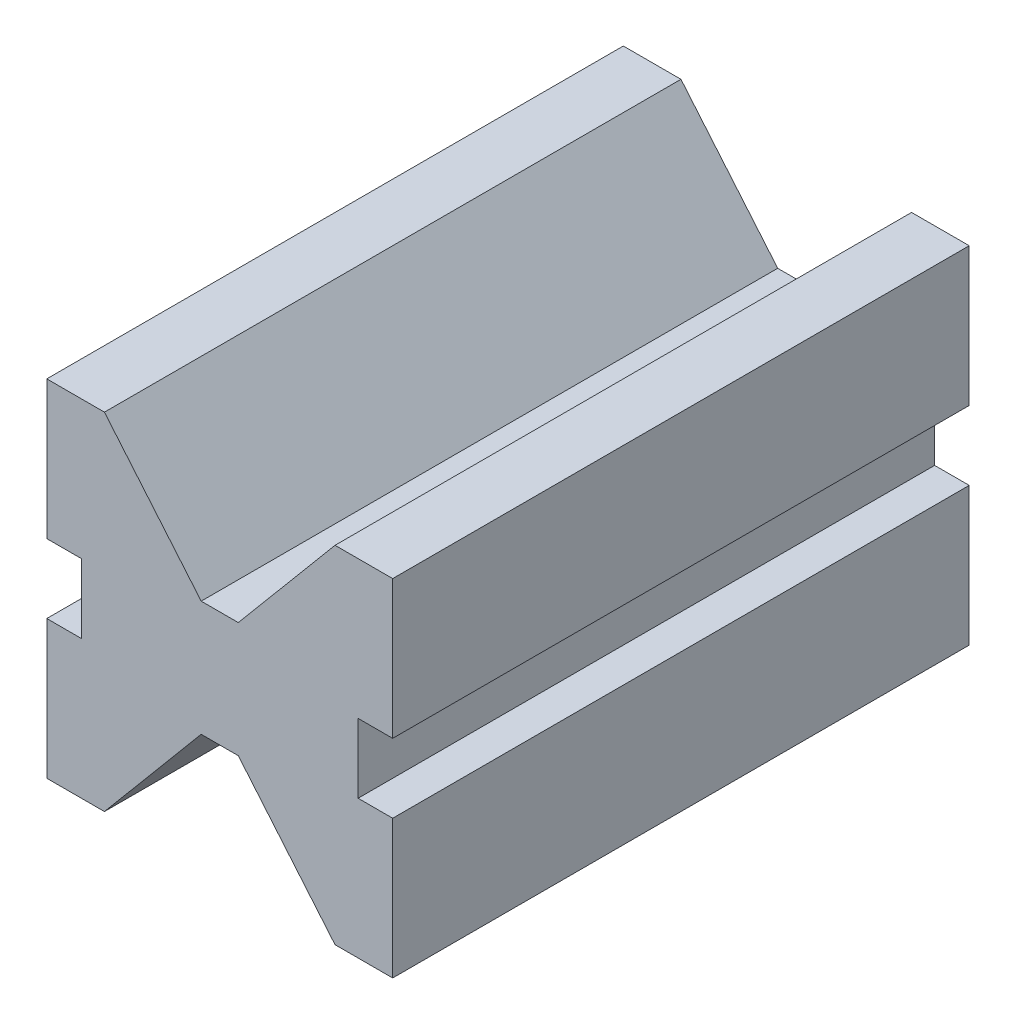
ISO-10303-21;
HEADER;
FILE_DESCRIPTION(('STEP AP214'),'2;1');
FILE_NAME('part.step','',(''),(''),'','','');
FILE_SCHEMA(('AUTOMOTIVE_DESIGN { 1 0 10303 214 1 1 1 1 }'));
ENDSEC;
DATA;
#1=APPLICATION_CONTEXT('core data for automotive mechanical design processes');
#2=APPLICATION_PROTOCOL_DEFINITION('international standard','automotive_design',2000,#1);
#3=PRODUCT_CONTEXT('',#1,'mechanical');
#4=PRODUCT('Part','Part','',(#3));
#5=PRODUCT_RELATED_PRODUCT_CATEGORY('part','',(#4));
#6=PRODUCT_DEFINITION_FORMATION('','',#4);
#7=PRODUCT_DEFINITION_CONTEXT('part definition',#1,'design');
#8=PRODUCT_DEFINITION('design','',#6,#7);
#9=PRODUCT_DEFINITION_SHAPE('','',#8);
#10=(LENGTH_UNIT() NAMED_UNIT(*) SI_UNIT(.MILLI.,.METRE.));
#11=(NAMED_UNIT(*) PLANE_ANGLE_UNIT() SI_UNIT($,.RADIAN.));
#12=(NAMED_UNIT(*) SI_UNIT($,.STERADIAN.) SOLID_ANGLE_UNIT());
#13=UNCERTAINTY_MEASURE_WITH_UNIT(LENGTH_MEASURE(1.E-05),#10,'distance_accuracy_value','');
#14=(GEOMETRIC_REPRESENTATION_CONTEXT(3) GLOBAL_UNCERTAINTY_ASSIGNED_CONTEXT((#13)) GLOBAL_UNIT_ASSIGNED_CONTEXT((#10,
#11,#12)) REPRESENTATION_CONTEXT('',''));
#15=CARTESIAN_POINT('',(0.,0.,0.));
#16=DIRECTION('',(0.,0.,1.));
#17=DIRECTION('',(1.,0.,0.));
#18=AXIS2_PLACEMENT_3D('',#15,#16,#17);
#19=CARTESIAN_POINT('',(0.,0.,-100.));
#20=DIRECTION('',(-1.,0.,0.));
#21=DIRECTION('',(0.,0.,1.));
#22=AXIS2_PLACEMENT_3D('',#19,#20,#21);
#23=PLANE('',#22);
#24=DIRECTION('',(0.,-1.,0.));
#25=VECTOR('',#24,1.);
#26=CARTESIAN_POINT('',(0.,0.,0.));
#27=LINE('',#26,#25);
#28=CARTESIAN_POINT('',(0.,24.,0.));
#29=VERTEX_POINT('',#28);
#30=CARTESIAN_POINT('',(0.,0.,0.));
#31=VERTEX_POINT('',#30);
#32=EDGE_CURVE('E204',#29,#31,#27,.T.);
#33=ORIENTED_EDGE('',*,*,#32,.F.);
#34=DIRECTION('',(0.,0.,1.));
#35=VECTOR('',#34,1.);
#36=CARTESIAN_POINT('',(0.,24.,-100.));
#37=LINE('',#36,#35);
#38=CARTESIAN_POINT('',(0.,24.,-100.));
#39=VERTEX_POINT('',#38);
#40=EDGE_CURVE('E11',#39,#29,#37,.T.);
#41=ORIENTED_EDGE('',*,*,#40,.F.);
#42=DIRECTION('',(0.,-1.,0.));
#43=VECTOR('',#42,1.);
#44=CARTESIAN_POINT('',(0.,0.,-100.));
#45=LINE('',#44,#43);
#46=CARTESIAN_POINT('',(0.,0.,-100.));
#47=VERTEX_POINT('',#46);
#48=EDGE_CURVE('E260',#39,#47,#45,.T.);
#49=ORIENTED_EDGE('',*,*,#48,.T.);
#50=DIRECTION('',(0.,0.,1.));
#51=VECTOR('',#50,1.);
#52=CARTESIAN_POINT('',(0.,0.,-100.));
#53=LINE('',#52,#51);
#54=EDGE_CURVE('E38',#47,#31,#53,.T.);
#55=ORIENTED_EDGE('',*,*,#54,.T.);
#56=EDGE_LOOP('',(#33,#41,#49,#55));
#57=FACE_BOUND('',#56,.T.);
#58=ADVANCED_FACE('F35',(#57),#23,.T.);
#59=CARTESIAN_POINT('',(0.,24.,-100.));
#60=DIRECTION('',(0.,1.,0.));
#61=DIRECTION('',(0.,0.,1.));
#62=AXIS2_PLACEMENT_3D('',#59,#60,#61);
#63=PLANE('',#62);
#64=DIRECTION('',(-1.,0.,0.));
#65=VECTOR('',#64,1.);
#66=CARTESIAN_POINT('',(0.,24.,0.));
#67=LINE('',#66,#65);
#68=CARTESIAN_POINT('',(6.,24.,0.));
#69=VERTEX_POINT('',#68);
#70=EDGE_CURVE('E258',#69,#29,#67,.T.);
#71=ORIENTED_EDGE('',*,*,#70,.F.);
#72=DIRECTION('',(0.,0.,1.));
#73=VECTOR('',#72,1.);
#74=CARTESIAN_POINT('',(6.,24.,-100.));
#75=LINE('',#74,#73);
#76=CARTESIAN_POINT('',(6.,24.,-100.));
#77=VERTEX_POINT('',#76);
#78=EDGE_CURVE('E44',#77,#69,#75,.T.);
#79=ORIENTED_EDGE('',*,*,#78,.F.);
#80=DIRECTION('',(-1.,0.,0.));
#81=VECTOR('',#80,1.);
#82=CARTESIAN_POINT('',(0.,24.,-100.));
#83=LINE('',#82,#81);
#84=EDGE_CURVE('E194',#77,#39,#83,.T.);
#85=ORIENTED_EDGE('',*,*,#84,.T.);
#86=ORIENTED_EDGE('',*,*,#40,.T.);
#87=EDGE_LOOP('',(#71,#79,#85,#86));
#88=FACE_BOUND('',#87,.T.);
#89=ADVANCED_FACE('F296',(#88),#63,.T.);
#90=CARTESIAN_POINT('',(6.,24.,-100.));
#91=DIRECTION('',(-1.,0.,0.));
#92=DIRECTION('',(0.,0.,1.));
#93=AXIS2_PLACEMENT_3D('',#90,#91,#92);
#94=PLANE('',#93);
#95=DIRECTION('',(0.,-1.,0.));
#96=VECTOR('',#95,1.);
#97=CARTESIAN_POINT('',(6.,24.,0.));
#98=LINE('',#97,#96);
#99=CARTESIAN_POINT('',(6.,36.,0.));
#100=VERTEX_POINT('',#99);
#101=EDGE_CURVE('E181',#100,#69,#98,.T.);
#102=ORIENTED_EDGE('',*,*,#101,.F.);
#103=DIRECTION('',(0.,0.,1.));
#104=VECTOR('',#103,1.);
#105=CARTESIAN_POINT('',(6.,36.,-100.));
#106=LINE('',#105,#104);
#107=CARTESIAN_POINT('',(6.,36.,-100.));
#108=VERTEX_POINT('',#107);
#109=EDGE_CURVE('E176',#108,#100,#106,.T.);
#110=ORIENTED_EDGE('',*,*,#109,.F.);
#111=DIRECTION('',(0.,-1.,0.));
#112=VECTOR('',#111,1.);
#113=CARTESIAN_POINT('',(6.,24.,-100.));
#114=LINE('',#113,#112);
#115=EDGE_CURVE('E179',#108,#77,#114,.T.);
#116=ORIENTED_EDGE('',*,*,#115,.T.);
#117=ORIENTED_EDGE('',*,*,#78,.T.);
#118=EDGE_LOOP('',(#102,#110,#116,#117));
#119=FACE_BOUND('',#118,.T.);
#120=ADVANCED_FACE('F178',(#119),#94,.T.);
#121=CARTESIAN_POINT('',(6.,36.,-100.));
#122=DIRECTION('',(0.,-1.,0.));
#123=DIRECTION('',(0.,0.,-1.));
#124=AXIS2_PLACEMENT_3D('',#121,#122,#123);
#125=PLANE('',#124);
#126=DIRECTION('',(1.,0.,0.));
#127=VECTOR('',#126,1.);
#128=CARTESIAN_POINT('',(6.,36.,0.));
#129=LINE('',#128,#127);
#130=CARTESIAN_POINT('',(0.,36.,0.));
#131=VERTEX_POINT('',#130);
#132=EDGE_CURVE('E255',#131,#100,#129,.T.);
#133=ORIENTED_EDGE('',*,*,#132,.F.);
#134=DIRECTION('',(0.,0.,1.));
#135=VECTOR('',#134,1.);
#136=CARTESIAN_POINT('',(0.,36.,-100.));
#137=LINE('',#136,#135);
#138=CARTESIAN_POINT('',(0.,36.,-100.));
#139=VERTEX_POINT('',#138);
#140=EDGE_CURVE('E186',#139,#131,#137,.T.);
#141=ORIENTED_EDGE('',*,*,#140,.F.);
#142=DIRECTION('',(1.,0.,0.));
#143=VECTOR('',#142,1.);
#144=CARTESIAN_POINT('',(6.,36.,-100.));
#145=LINE('',#144,#143);
#146=EDGE_CURVE('E192',#139,#108,#145,.T.);
#147=ORIENTED_EDGE('',*,*,#146,.T.);
#148=ORIENTED_EDGE('',*,*,#109,.T.);
#149=EDGE_LOOP('',(#133,#141,#147,#148));
#150=FACE_BOUND('',#149,.T.);
#151=ADVANCED_FACE('F196',(#150),#125,.T.);
#152=CARTESIAN_POINT('',(0.,36.,-100.));
#153=DIRECTION('',(-1.,0.,0.));
#154=DIRECTION('',(0.,0.,1.));
#155=AXIS2_PLACEMENT_3D('',#152,#153,#154);
#156=PLANE('',#155);
#157=DIRECTION('',(0.,-1.,0.));
#158=VECTOR('',#157,1.);
#159=CARTESIAN_POINT('',(0.,36.,0.));
#160=LINE('',#159,#158);
#161=CARTESIAN_POINT('',(0.,60.,0.));
#162=VERTEX_POINT('',#161);
#163=EDGE_CURVE('E252',#162,#131,#160,.T.);
#164=ORIENTED_EDGE('',*,*,#163,.F.);
#165=DIRECTION('',(0.,0.,1.));
#166=VECTOR('',#165,1.);
#167=CARTESIAN_POINT('',(0.,60.,-100.));
#168=LINE('',#167,#166);
#169=CARTESIAN_POINT('',(0.,60.,-100.));
#170=VERTEX_POINT('',#169);
#171=EDGE_CURVE('E264',#170,#162,#168,.T.);
#172=ORIENTED_EDGE('',*,*,#171,.F.);
#173=DIRECTION('',(0.,-1.,0.));
#174=VECTOR('',#173,1.);
#175=CARTESIAN_POINT('',(0.,36.,-100.));
#176=LINE('',#175,#174);
#177=EDGE_CURVE('E197',#170,#139,#176,.T.);
#178=ORIENTED_EDGE('',*,*,#177,.T.);
#179=ORIENTED_EDGE('',*,*,#140,.T.);
#180=EDGE_LOOP('',(#164,#172,#178,#179));
#181=FACE_BOUND('',#180,.T.);
#182=ADVANCED_FACE('F309',(#181),#156,.T.);
#183=CARTESIAN_POINT('',(0.,60.,-100.));
#184=DIRECTION('',(0.,1.,0.));
#185=DIRECTION('',(0.,0.,1.));
#186=AXIS2_PLACEMENT_3D('',#183,#184,#185);
#187=PLANE('',#186);
#188=DIRECTION('',(-1.,0.,0.));
#189=VECTOR('',#188,1.);
#190=CARTESIAN_POINT('',(0.,60.,0.));
#191=LINE('',#190,#189);
#192=CARTESIAN_POINT('',(10.,60.,0.));
#193=VERTEX_POINT('',#192);
#194=EDGE_CURVE('E249',#193,#162,#191,.T.);
#195=ORIENTED_EDGE('',*,*,#194,.F.);
#196=DIRECTION('',(0.,0.,1.));
#197=VECTOR('',#196,1.);
#198=CARTESIAN_POINT('',(10.,60.,-100.));
#199=LINE('',#198,#197);
#200=CARTESIAN_POINT('',(10.,60.,-100.));
#201=VERTEX_POINT('',#200);
#202=EDGE_CURVE('E266',#201,#193,#199,.T.);
#203=ORIENTED_EDGE('',*,*,#202,.F.);
#204=DIRECTION('',(-1.,0.,0.));
#205=VECTOR('',#204,1.);
#206=CARTESIAN_POINT('',(0.,60.,-100.));
#207=LINE('',#206,#205);
#208=EDGE_CURVE('E199',#201,#170,#207,.T.);
#209=ORIENTED_EDGE('',*,*,#208,.T.);
#210=ORIENTED_EDGE('',*,*,#171,.T.);
#211=EDGE_LOOP('',(#195,#203,#209,#210));
#212=FACE_BOUND('',#211,.T.);
#213=ADVANCED_FACE('F312',(#212),#187,.T.);
#214=CARTESIAN_POINT('',(10.,60.,-100.));
#215=DIRECTION('',(0.766044443118979,0.642787609686539,0.));
#216=DIRECTION('',(-0.642787609686539,0.766044443118979,0.));
#217=AXIS2_PLACEMENT_3D('',#214,#215,#216);
#218=PLANE('',#217);
#219=DIRECTION('',(-0.642787609686538,0.766044443118979,0.));
#220=VECTOR('',#219,1.);
#221=CARTESIAN_POINT('',(10.,60.,0.));
#222=LINE('',#221,#220);
#223=CARTESIAN_POINT('',(26.7819926235456,40.,0.));
#224=VERTEX_POINT('',#223);
#225=EDGE_CURVE('E246',#224,#193,#222,.T.);
#226=ORIENTED_EDGE('',*,*,#225,.F.);
#227=DIRECTION('',(0.,0.,1.));
#228=VECTOR('',#227,1.);
#229=CARTESIAN_POINT('',(26.7819926235456,40.,-100.));
#230=LINE('',#229,#228);
#231=CARTESIAN_POINT('',(26.7819926235456,40.,-100.));
#232=VERTEX_POINT('',#231);
#233=EDGE_CURVE('E268',#232,#224,#230,.T.);
#234=ORIENTED_EDGE('',*,*,#233,.F.);
#235=DIRECTION('',(-0.642787609686538,0.766044443118979,0.));
#236=VECTOR('',#235,1.);
#237=CARTESIAN_POINT('',(10.,60.,-100.));
#238=LINE('',#237,#236);
#239=EDGE_CURVE('E551',#232,#201,#238,.T.);
#240=ORIENTED_EDGE('',*,*,#239,.T.);
#241=ORIENTED_EDGE('',*,*,#202,.T.);
#242=EDGE_LOOP('',(#226,#234,#240,#241));
#243=FACE_BOUND('',#242,.T.);
#244=ADVANCED_FACE('F316',(#243),#218,.T.);
#245=CARTESIAN_POINT('',(26.7819926235456,40.,-100.));
#246=DIRECTION('',(0.,1.,0.));
#247=DIRECTION('',(0.,0.,1.));
#248=AXIS2_PLACEMENT_3D('',#245,#246,#247);
#249=PLANE('',#248);
#250=DIRECTION('',(-1.,0.,0.));
#251=VECTOR('',#250,1.);
#252=CARTESIAN_POINT('',(26.7819926235456,40.,0.));
#253=LINE('',#252,#251);
#254=CARTESIAN_POINT('',(33.2180073764544,40.,0.));
#255=VERTEX_POINT('',#254);
#256=EDGE_CURVE('E243',#255,#224,#253,.T.);
#257=ORIENTED_EDGE('',*,*,#256,.F.);
#258=DIRECTION('',(0.,0.,1.));
#259=VECTOR('',#258,1.);
#260=CARTESIAN_POINT('',(33.2180073764544,40.,-100.));
#261=LINE('',#260,#259);
#262=CARTESIAN_POINT('',(33.2180073764544,40.,-100.));
#263=VERTEX_POINT('',#262);
#264=EDGE_CURVE('E270',#263,#255,#261,.T.);
#265=ORIENTED_EDGE('',*,*,#264,.F.);
#266=DIRECTION('',(-1.,0.,0.));
#267=VECTOR('',#266,1.);
#268=CARTESIAN_POINT('',(26.7819926235456,40.,-100.));
#269=LINE('',#268,#267);
#270=EDGE_CURVE('E544',#263,#232,#269,.T.);
#271=ORIENTED_EDGE('',*,*,#270,.T.);
#272=ORIENTED_EDGE('',*,*,#233,.T.);
#273=EDGE_LOOP('',(#257,#265,#271,#272));
#274=FACE_BOUND('',#273,.T.);
#275=ADVANCED_FACE('F320',(#274),#249,.T.);
#276=CARTESIAN_POINT('',(50.,60.,-100.));
#277=DIRECTION('',(-0.766044443118979,0.642787609686538,0.));
#278=DIRECTION('',(-0.642787609686538,-0.766044443118979,0.));
#279=AXIS2_PLACEMENT_3D('',#276,#277,#278);
#280=PLANE('',#279);
#281=DIRECTION('',(-0.642787609686538,-0.766044443118979,0.));
#282=VECTOR('',#281,1.);
#283=CARTESIAN_POINT('',(50.,60.,0.));
#284=LINE('',#283,#282);
#285=CARTESIAN_POINT('',(50.,60.,0.));
#286=VERTEX_POINT('',#285);
#287=EDGE_CURVE('E240',#286,#255,#284,.T.);
#288=ORIENTED_EDGE('',*,*,#287,.F.);
#289=DIRECTION('',(0.,0.,1.));
#290=VECTOR('',#289,1.);
#291=CARTESIAN_POINT('',(50.,60.,-100.));
#292=LINE('',#291,#290);
#293=CARTESIAN_POINT('',(50.,60.,-100.));
#294=VERTEX_POINT('',#293);
#295=EDGE_CURVE('E272',#294,#286,#292,.T.);
#296=ORIENTED_EDGE('',*,*,#295,.F.);
#297=DIRECTION('',(-0.642787609686538,-0.766044443118979,0.));
#298=VECTOR('',#297,1.);
#299=CARTESIAN_POINT('',(50.,60.,-100.));
#300=LINE('',#299,#298);
#301=EDGE_CURVE('E540',#294,#263,#300,.T.);
#302=ORIENTED_EDGE('',*,*,#301,.T.);
#303=ORIENTED_EDGE('',*,*,#264,.T.);
#304=EDGE_LOOP('',(#288,#296,#302,#303));
#305=FACE_BOUND('',#304,.T.);
#306=ADVANCED_FACE('F324',(#305),#280,.T.);
#307=CARTESIAN_POINT('',(60.,60.,-100.));
#308=DIRECTION('',(0.,1.,0.));
#309=DIRECTION('',(0.,0.,1.));
#310=AXIS2_PLACEMENT_3D('',#307,#308,#309);
#311=PLANE('',#310);
#312=DIRECTION('',(-1.,0.,0.));
#313=VECTOR('',#312,1.);
#314=CARTESIAN_POINT('',(60.,60.,0.));
#315=LINE('',#314,#313);
#316=CARTESIAN_POINT('',(60.,60.,0.));
#317=VERTEX_POINT('',#316);
#318=EDGE_CURVE('E237',#317,#286,#315,.T.);
#319=ORIENTED_EDGE('',*,*,#318,.F.);
#320=DIRECTION('',(0.,0.,1.));
#321=VECTOR('',#320,1.);
#322=CARTESIAN_POINT('',(60.,60.,-100.));
#323=LINE('',#322,#321);
#324=CARTESIAN_POINT('',(60.,60.,-100.));
#325=VERTEX_POINT('',#324);
#326=EDGE_CURVE('E274',#325,#317,#323,.T.);
#327=ORIENTED_EDGE('',*,*,#326,.F.);
#328=DIRECTION('',(-1.,0.,0.));
#329=VECTOR('',#328,1.);
#330=CARTESIAN_POINT('',(60.,60.,-100.));
#331=LINE('',#330,#329);
#332=EDGE_CURVE('E556',#325,#294,#331,.T.);
#333=ORIENTED_EDGE('',*,*,#332,.T.);
#334=ORIENTED_EDGE('',*,*,#295,.T.);
#335=EDGE_LOOP('',(#319,#327,#333,#334));
#336=FACE_BOUND('',#335,.T.);
#337=ADVANCED_FACE('F328',(#336),#311,.T.);
#338=CARTESIAN_POINT('',(60.,36.,-100.));
#339=DIRECTION('',(1.,0.,0.));
#340=DIRECTION('',(0.,1.,0.));
#341=AXIS2_PLACEMENT_3D('',#338,#339,#340);
#342=PLANE('',#341);
#343=DIRECTION('',(0.,1.,0.));
#344=VECTOR('',#343,1.);
#345=CARTESIAN_POINT('',(60.,36.,0.));
#346=LINE('',#345,#344);
#347=CARTESIAN_POINT('',(60.,36.,0.));
#348=VERTEX_POINT('',#347);
#349=EDGE_CURVE('E234',#348,#317,#346,.T.);
#350=ORIENTED_EDGE('',*,*,#349,.F.);
#351=DIRECTION('',(0.,0.,1.));
#352=VECTOR('',#351,1.);
#353=CARTESIAN_POINT('',(60.,36.,-100.));
#354=LINE('',#353,#352);
#355=CARTESIAN_POINT('',(60.,36.,-100.));
#356=VERTEX_POINT('',#355);
#357=EDGE_CURVE('E276',#356,#348,#354,.T.);
#358=ORIENTED_EDGE('',*,*,#357,.F.);
#359=DIRECTION('',(0.,1.,0.));
#360=VECTOR('',#359,1.);
#361=CARTESIAN_POINT('',(60.,36.,-100.));
#362=LINE('',#361,#360);
#363=EDGE_CURVE('E533',#356,#325,#362,.T.);
#364=ORIENTED_EDGE('',*,*,#363,.T.);
#365=ORIENTED_EDGE('',*,*,#326,.T.);
#366=EDGE_LOOP('',(#350,#358,#364,#365));
#367=FACE_BOUND('',#366,.T.);
#368=ADVANCED_FACE('F332',(#367),#342,.T.);
#369=CARTESIAN_POINT('',(54.,36.,-100.));
#370=DIRECTION('',(0.,-1.,0.));
#371=DIRECTION('',(0.,0.,-1.));
#372=AXIS2_PLACEMENT_3D('',#369,#370,#371);
#373=PLANE('',#372);
#374=DIRECTION('',(1.,0.,0.));
#375=VECTOR('',#374,1.);
#376=CARTESIAN_POINT('',(54.,36.,0.));
#377=LINE('',#376,#375);
#378=CARTESIAN_POINT('',(54.,36.,0.));
#379=VERTEX_POINT('',#378);
#380=EDGE_CURVE('E231',#379,#348,#377,.T.);
#381=ORIENTED_EDGE('',*,*,#380,.F.);
#382=DIRECTION('',(0.,0.,1.));
#383=VECTOR('',#382,1.);
#384=CARTESIAN_POINT('',(54.,36.,-100.));
#385=LINE('',#384,#383);
#386=CARTESIAN_POINT('',(54.,36.,-100.));
#387=VERTEX_POINT('',#386);
#388=EDGE_CURVE('E278',#387,#379,#385,.T.);
#389=ORIENTED_EDGE('',*,*,#388,.F.);
#390=DIRECTION('',(1.,0.,0.));
#391=VECTOR('',#390,1.);
#392=CARTESIAN_POINT('',(54.,36.,-100.));
#393=LINE('',#392,#391);
#394=EDGE_CURVE('E529',#387,#356,#393,.T.);
#395=ORIENTED_EDGE('',*,*,#394,.T.);
#396=ORIENTED_EDGE('',*,*,#357,.T.);
#397=EDGE_LOOP('',(#381,#389,#395,#396));
#398=FACE_BOUND('',#397,.T.);
#399=ADVANCED_FACE('F336',(#398),#373,.T.);
#400=CARTESIAN_POINT('',(54.,24.,-100.));
#401=DIRECTION('',(1.,0.,0.));
#402=DIRECTION('',(0.,1.,0.));
#403=AXIS2_PLACEMENT_3D('',#400,#401,#402);
#404=PLANE('',#403);
#405=DIRECTION('',(0.,1.,0.));
#406=VECTOR('',#405,1.);
#407=CARTESIAN_POINT('',(54.,24.,0.));
#408=LINE('',#407,#406);
#409=CARTESIAN_POINT('',(54.,24.,0.));
#410=VERTEX_POINT('',#409);
#411=EDGE_CURVE('E228',#410,#379,#408,.T.);
#412=ORIENTED_EDGE('',*,*,#411,.F.);
#413=DIRECTION('',(0.,0.,1.));
#414=VECTOR('',#413,1.);
#415=CARTESIAN_POINT('',(54.,24.,-100.));
#416=LINE('',#415,#414);
#417=CARTESIAN_POINT('',(54.,24.,-100.));
#418=VERTEX_POINT('',#417);
#419=EDGE_CURVE('E280',#418,#410,#416,.T.);
#420=ORIENTED_EDGE('',*,*,#419,.F.);
#421=DIRECTION('',(0.,1.,0.));
#422=VECTOR('',#421,1.);
#423=CARTESIAN_POINT('',(54.,24.,-100.));
#424=LINE('',#423,#422);
#425=EDGE_CURVE('E560',#418,#387,#424,.T.);
#426=ORIENTED_EDGE('',*,*,#425,.T.);
#427=ORIENTED_EDGE('',*,*,#388,.T.);
#428=EDGE_LOOP('',(#412,#420,#426,#427));
#429=FACE_BOUND('',#428,.T.);
#430=ADVANCED_FACE('F340',(#429),#404,.T.);
#431=CARTESIAN_POINT('',(60.,24.,-100.));
#432=DIRECTION('',(0.,1.,0.));
#433=DIRECTION('',(-1.,0.,0.));
#434=AXIS2_PLACEMENT_3D('',#431,#432,#433);
#435=PLANE('',#434);
#436=DIRECTION('',(-1.,0.,0.));
#437=VECTOR('',#436,1.);
#438=CARTESIAN_POINT('',(60.,24.,0.));
#439=LINE('',#438,#437);
#440=CARTESIAN_POINT('',(60.,24.,0.));
#441=VERTEX_POINT('',#440);
#442=EDGE_CURVE('E225',#441,#410,#439,.T.);
#443=ORIENTED_EDGE('',*,*,#442,.F.);
#444=DIRECTION('',(0.,0.,1.));
#445=VECTOR('',#444,1.);
#446=CARTESIAN_POINT('',(60.,24.,-100.));
#447=LINE('',#446,#445);
#448=CARTESIAN_POINT('',(60.,24.,-100.));
#449=VERTEX_POINT('',#448);
#450=EDGE_CURVE('E282',#449,#441,#447,.T.);
#451=ORIENTED_EDGE('',*,*,#450,.F.);
#452=DIRECTION('',(-1.,0.,0.));
#453=VECTOR('',#452,1.);
#454=CARTESIAN_POINT('',(60.,24.,-100.));
#455=LINE('',#454,#453);
#456=EDGE_CURVE('E522',#449,#418,#455,.T.);
#457=ORIENTED_EDGE('',*,*,#456,.T.);
#458=ORIENTED_EDGE('',*,*,#419,.T.);
#459=EDGE_LOOP('',(#443,#451,#457,#458));
#460=FACE_BOUND('',#459,.T.);
#461=ADVANCED_FACE('F344',(#460),#435,.T.);
#462=CARTESIAN_POINT('',(60.,0.,-100.));
#463=DIRECTION('',(1.,0.,0.));
#464=DIRECTION('',(0.,1.,0.));
#465=AXIS2_PLACEMENT_3D('',#462,#463,#464);
#466=PLANE('',#465);
#467=DIRECTION('',(0.,1.,0.));
#468=VECTOR('',#467,1.);
#469=CARTESIAN_POINT('',(60.,0.,0.));
#470=LINE('',#469,#468);
#471=CARTESIAN_POINT('',(60.,0.,0.));
#472=VERTEX_POINT('',#471);
#473=EDGE_CURVE('E222',#472,#441,#470,.T.);
#474=ORIENTED_EDGE('',*,*,#473,.F.);
#475=DIRECTION('',(0.,0.,1.));
#476=VECTOR('',#475,1.);
#477=CARTESIAN_POINT('',(60.,0.,-100.));
#478=LINE('',#477,#476);
#479=CARTESIAN_POINT('',(60.,0.,-100.));
#480=VERTEX_POINT('',#479);
#481=EDGE_CURVE('E284',#480,#472,#478,.T.);
#482=ORIENTED_EDGE('',*,*,#481,.F.);
#483=DIRECTION('',(0.,1.,0.));
#484=VECTOR('',#483,1.);
#485=CARTESIAN_POINT('',(60.,0.,-100.));
#486=LINE('',#485,#484);
#487=EDGE_CURVE('E518',#480,#449,#486,.T.);
#488=ORIENTED_EDGE('',*,*,#487,.T.);
#489=ORIENTED_EDGE('',*,*,#450,.T.);
#490=EDGE_LOOP('',(#474,#482,#488,#489));
#491=FACE_BOUND('',#490,.T.);
#492=ADVANCED_FACE('F348',(#491),#466,.T.);
#493=CARTESIAN_POINT('',(60.,0.,-100.));
#494=DIRECTION('',(0.,-1.,0.));
#495=DIRECTION('',(0.,0.,-1.));
#496=AXIS2_PLACEMENT_3D('',#493,#494,#495);
#497=PLANE('',#496);
#498=DIRECTION('',(1.,0.,0.));
#499=VECTOR('',#498,1.);
#500=CARTESIAN_POINT('',(60.,0.,0.));
#501=LINE('',#500,#499);
#502=CARTESIAN_POINT('',(50.,0.,0.));
#503=VERTEX_POINT('',#502);
#504=EDGE_CURVE('E219',#503,#472,#501,.T.);
#505=ORIENTED_EDGE('',*,*,#504,.F.);
#506=DIRECTION('',(0.,0.,1.));
#507=VECTOR('',#506,1.);
#508=CARTESIAN_POINT('',(50.,0.,-100.));
#509=LINE('',#508,#507);
#510=CARTESIAN_POINT('',(50.,0.,-100.));
#511=VERTEX_POINT('',#510);
#512=EDGE_CURVE('E286',#511,#503,#509,.T.);
#513=ORIENTED_EDGE('',*,*,#512,.F.);
#514=DIRECTION('',(1.,0.,0.));
#515=VECTOR('',#514,1.);
#516=CARTESIAN_POINT('',(60.,0.,-100.));
#517=LINE('',#516,#515);
#518=EDGE_CURVE('E564',#511,#480,#517,.T.);
#519=ORIENTED_EDGE('',*,*,#518,.T.);
#520=ORIENTED_EDGE('',*,*,#481,.T.);
#521=EDGE_LOOP('',(#505,#513,#519,#520));
#522=FACE_BOUND('',#521,.T.);
#523=ADVANCED_FACE('F352',(#522),#497,.T.);
#524=CARTESIAN_POINT('',(50.,0.,-100.));
#525=DIRECTION('',(-0.766044443118979,-0.642787609686539,0.));
#526=DIRECTION('',(0.642787609686539,-0.766044443118979,0.));
#527=AXIS2_PLACEMENT_3D('',#524,#525,#526);
#528=PLANE('',#527);
#529=DIRECTION('',(0.642787609686539,-0.766044443118979,0.));
#530=VECTOR('',#529,1.);
#531=CARTESIAN_POINT('',(50.,0.,0.));
#532=LINE('',#531,#530);
#533=CARTESIAN_POINT('',(33.2180073764544,20.,0.));
#534=VERTEX_POINT('',#533);
#535=EDGE_CURVE('E216',#534,#503,#532,.T.);
#536=ORIENTED_EDGE('',*,*,#535,.F.);
#537=DIRECTION('',(0.,0.,1.));
#538=VECTOR('',#537,1.);
#539=CARTESIAN_POINT('',(33.2180073764544,20.,-100.));
#540=LINE('',#539,#538);
#541=CARTESIAN_POINT('',(33.2180073764544,20.,-100.));
#542=VERTEX_POINT('',#541);
#543=EDGE_CURVE('E288',#542,#534,#540,.T.);
#544=ORIENTED_EDGE('',*,*,#543,.F.);
#545=DIRECTION('',(0.642787609686539,-0.766044443118979,0.));
#546=VECTOR('',#545,1.);
#547=CARTESIAN_POINT('',(50.,0.,-100.));
#548=LINE('',#547,#546);
#549=EDGE_CURVE('E511',#542,#511,#548,.T.);
#550=ORIENTED_EDGE('',*,*,#549,.T.);
#551=ORIENTED_EDGE('',*,*,#512,.T.);
#552=EDGE_LOOP('',(#536,#544,#550,#551));
#553=FACE_BOUND('',#552,.T.);
#554=ADVANCED_FACE('F356',(#553),#528,.T.);
#555=CARTESIAN_POINT('',(26.7819926235456,20.,-100.));
#556=DIRECTION('',(0.,-1.,0.));
#557=DIRECTION('',(0.,0.,-1.));
#558=AXIS2_PLACEMENT_3D('',#555,#556,#557);
#559=PLANE('',#558);
#560=DIRECTION('',(1.,0.,0.));
#561=VECTOR('',#560,1.);
#562=CARTESIAN_POINT('',(26.7819926235456,20.,0.));
#563=LINE('',#562,#561);
#564=CARTESIAN_POINT('',(26.7819926235456,20.,0.));
#565=VERTEX_POINT('',#564);
#566=EDGE_CURVE('E213',#565,#534,#563,.T.);
#567=ORIENTED_EDGE('',*,*,#566,.F.);
#568=DIRECTION('',(0.,0.,1.));
#569=VECTOR('',#568,1.);
#570=CARTESIAN_POINT('',(26.7819926235456,20.,-100.));
#571=LINE('',#570,#569);
#572=CARTESIAN_POINT('',(26.7819926235456,20.,-100.));
#573=VERTEX_POINT('',#572);
#574=EDGE_CURVE('E290',#573,#565,#571,.T.);
#575=ORIENTED_EDGE('',*,*,#574,.F.);
#576=DIRECTION('',(1.,0.,0.));
#577=VECTOR('',#576,1.);
#578=CARTESIAN_POINT('',(26.7819926235456,20.,-100.));
#579=LINE('',#578,#577);
#580=EDGE_CURVE('E507',#573,#542,#579,.T.);
#581=ORIENTED_EDGE('',*,*,#580,.T.);
#582=ORIENTED_EDGE('',*,*,#543,.T.);
#583=EDGE_LOOP('',(#567,#575,#581,#582));
#584=FACE_BOUND('',#583,.T.);
#585=ADVANCED_FACE('F360',(#584),#559,.T.);
#586=CARTESIAN_POINT('',(10.,0.,-100.));
#587=DIRECTION('',(0.766044443118979,-0.642787609686539,0.));
#588=DIRECTION('',(0.642787609686539,0.766044443118979,0.));
#589=AXIS2_PLACEMENT_3D('',#586,#587,#588);
#590=PLANE('',#589);
#591=DIRECTION('',(0.642787609686539,0.766044443118979,0.));
#592=VECTOR('',#591,1.);
#593=CARTESIAN_POINT('',(10.,0.,0.));
#594=LINE('',#593,#592);
#595=CARTESIAN_POINT('',(10.,0.,0.));
#596=VERTEX_POINT('',#595);
#597=EDGE_CURVE('E210',#596,#565,#594,.T.);
#598=ORIENTED_EDGE('',*,*,#597,.F.);
#599=DIRECTION('',(0.,0.,1.));
#600=VECTOR('',#599,1.);
#601=CARTESIAN_POINT('',(10.,0.,-100.));
#602=LINE('',#601,#600);
#603=CARTESIAN_POINT('',(10.,0.,-100.));
#604=VERTEX_POINT('',#603);
#605=EDGE_CURVE('E291',#604,#596,#602,.T.);
#606=ORIENTED_EDGE('',*,*,#605,.F.);
#607=DIRECTION('',(0.642787609686539,0.766044443118979,0.));
#608=VECTOR('',#607,1.);
#609=CARTESIAN_POINT('',(10.,0.,-100.));
#610=LINE('',#609,#608);
#611=EDGE_CURVE('E568',#604,#573,#610,.T.);
#612=ORIENTED_EDGE('',*,*,#611,.T.);
#613=ORIENTED_EDGE('',*,*,#574,.T.);
#614=EDGE_LOOP('',(#598,#606,#612,#613));
#615=FACE_BOUND('',#614,.T.);
#616=ADVANCED_FACE('F364',(#615),#590,.T.);
#617=CARTESIAN_POINT('',(0.,0.,-100.));
#618=DIRECTION('',(0.,-1.,0.));
#619=DIRECTION('',(0.,0.,-1.));
#620=AXIS2_PLACEMENT_3D('',#617,#618,#619);
#621=PLANE('',#620);
#622=DIRECTION('',(1.,0.,0.));
#623=VECTOR('',#622,1.);
#624=CARTESIAN_POINT('',(0.,0.,0.));
#625=LINE('',#624,#623);
#626=EDGE_CURVE('E207',#31,#596,#625,.T.);
#627=ORIENTED_EDGE('',*,*,#626,.F.);
#628=ORIENTED_EDGE('',*,*,#54,.F.);
#629=DIRECTION('',(1.,0.,0.));
#630=VECTOR('',#629,1.);
#631=CARTESIAN_POINT('',(0.,0.,-100.));
#632=LINE('',#631,#630);
#633=EDGE_CURVE('E570',#47,#604,#632,.T.);
#634=ORIENTED_EDGE('',*,*,#633,.T.);
#635=ORIENTED_EDGE('',*,*,#605,.T.);
#636=EDGE_LOOP('',(#627,#628,#634,#635));
#637=FACE_BOUND('',#636,.T.);
#638=ADVANCED_FACE('F293',(#637),#621,.T.);
#639=CARTESIAN_POINT('',(0.,0.,-100.));
#640=DIRECTION('',(0.,0.,-1.));
#641=DIRECTION('',(-1.,0.,0.));
#642=AXIS2_PLACEMENT_3D('',#639,#640,#641);
#643=PLANE('',#642);
#644=ORIENTED_EDGE('',*,*,#48,.F.);
#645=ORIENTED_EDGE('',*,*,#84,.F.);
#646=ORIENTED_EDGE('',*,*,#115,.F.);
#647=ORIENTED_EDGE('',*,*,#146,.F.);
#648=ORIENTED_EDGE('',*,*,#177,.F.);
#649=ORIENTED_EDGE('',*,*,#208,.F.);
#650=ORIENTED_EDGE('',*,*,#239,.F.);
#651=ORIENTED_EDGE('',*,*,#270,.F.);
#652=ORIENTED_EDGE('',*,*,#301,.F.);
#653=ORIENTED_EDGE('',*,*,#332,.F.);
#654=ORIENTED_EDGE('',*,*,#363,.F.);
#655=ORIENTED_EDGE('',*,*,#394,.F.);
#656=ORIENTED_EDGE('',*,*,#425,.F.);
#657=ORIENTED_EDGE('',*,*,#456,.F.);
#658=ORIENTED_EDGE('',*,*,#487,.F.);
#659=ORIENTED_EDGE('',*,*,#518,.F.);
#660=ORIENTED_EDGE('',*,*,#549,.F.);
#661=ORIENTED_EDGE('',*,*,#580,.F.);
#662=ORIENTED_EDGE('',*,*,#611,.F.);
#663=ORIENTED_EDGE('',*,*,#633,.F.);
#664=EDGE_LOOP('',(#644,#645,#646,#647,#648,#649,#650,#651,#652,#653,#654,#655,#656,#657,#658,
#659,#660,#661,#662,#663));
#665=FACE_BOUND('',#664,.T.);
#666=ADVANCED_FACE('F190',(#665),#643,.T.);
#667=CARTESIAN_POINT('',(0.,0.,0.));
#668=DIRECTION('',(0.,0.,-1.));
#669=DIRECTION('',(-1.,0.,0.));
#670=AXIS2_PLACEMENT_3D('',#667,#668,#669);
#671=PLANE('',#670);
#672=ORIENTED_EDGE('',*,*,#32,.T.);
#673=ORIENTED_EDGE('',*,*,#626,.T.);
#674=ORIENTED_EDGE('',*,*,#597,.T.);
#675=ORIENTED_EDGE('',*,*,#566,.T.);
#676=ORIENTED_EDGE('',*,*,#535,.T.);
#677=ORIENTED_EDGE('',*,*,#504,.T.);
#678=ORIENTED_EDGE('',*,*,#473,.T.);
#679=ORIENTED_EDGE('',*,*,#442,.T.);
#680=ORIENTED_EDGE('',*,*,#411,.T.);
#681=ORIENTED_EDGE('',*,*,#380,.T.);
#682=ORIENTED_EDGE('',*,*,#349,.T.);
#683=ORIENTED_EDGE('',*,*,#318,.T.);
#684=ORIENTED_EDGE('',*,*,#287,.T.);
#685=ORIENTED_EDGE('',*,*,#256,.T.);
#686=ORIENTED_EDGE('',*,*,#225,.T.);
#687=ORIENTED_EDGE('',*,*,#194,.T.);
#688=ORIENTED_EDGE('',*,*,#163,.T.);
#689=ORIENTED_EDGE('',*,*,#132,.T.);
#690=ORIENTED_EDGE('',*,*,#101,.T.);
#691=ORIENTED_EDGE('',*,*,#70,.T.);
#692=EDGE_LOOP('',(#672,#673,#674,#675,#676,#677,#678,#679,#680,#681,#682,#683,#684,#685,#686,
#687,#688,#689,#690,#691));
#693=FACE_BOUND('',#692,.T.);
#694=ADVANCED_FACE('F295',(#693),#671,.F.);
#695=CLOSED_SHELL('',(#58,#89,#120,#151,#182,#213,#244,#275,#306,#337,#368,#399,#430,#461,#492,
#523,#554,#585,#616,#638,#666,#694));
#696=MANIFOLD_SOLID_BREP('B2',#695);
#697=ADVANCED_BREP_SHAPE_REPRESENTATION('',(#18,#696),#14);
#698=SHAPE_DEFINITION_REPRESENTATION(#9,#697);
ENDSEC;
END-ISO-10303-21;
